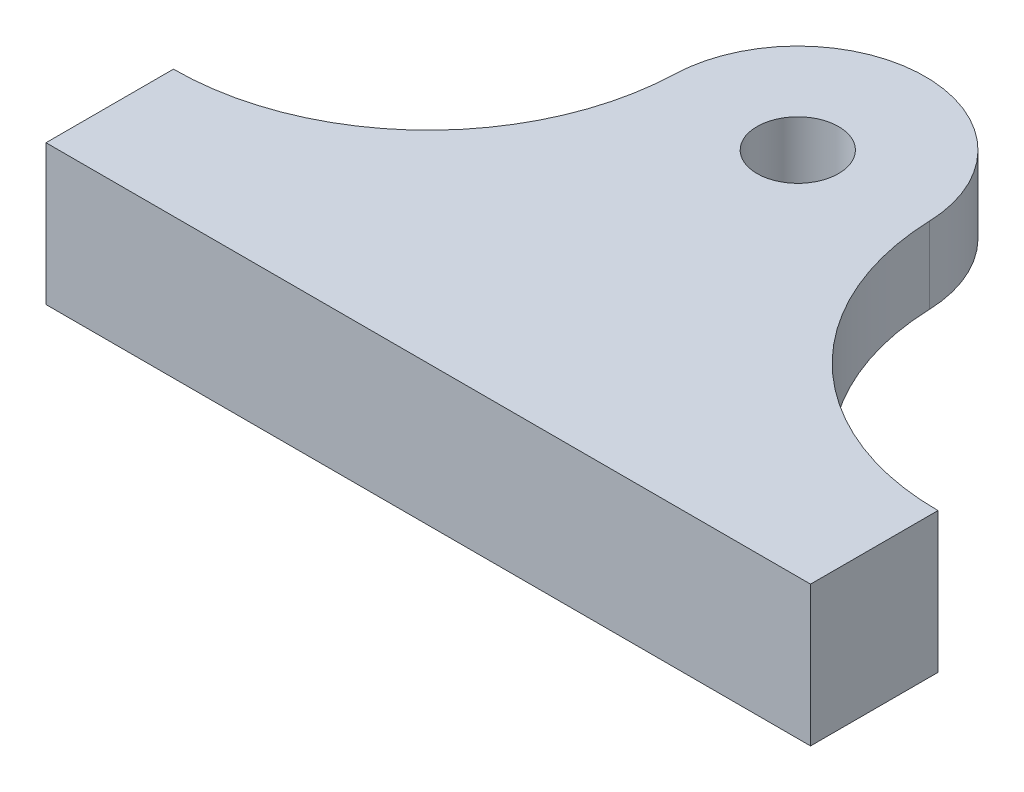
ISO-10303-21;
HEADER;
FILE_DESCRIPTION(('STEP AP214'),'2;1');
FILE_NAME('part.step','',(''),(''),'','','');
FILE_SCHEMA(('AUTOMOTIVE_DESIGN { 1 0 10303 214 1 1 1 1 }'));
ENDSEC;
DATA;
#1=APPLICATION_CONTEXT('core data for automotive mechanical design processes');
#2=APPLICATION_PROTOCOL_DEFINITION('international standard','automotive_design',2000,#1);
#3=PRODUCT_CONTEXT('',#1,'mechanical');
#4=PRODUCT('Part','Part','',(#3));
#5=PRODUCT_RELATED_PRODUCT_CATEGORY('part','',(#4));
#6=PRODUCT_DEFINITION_FORMATION('','',#4);
#7=PRODUCT_DEFINITION_CONTEXT('part definition',#1,'design');
#8=PRODUCT_DEFINITION('design','',#6,#7);
#9=PRODUCT_DEFINITION_SHAPE('','',#8);
#10=(LENGTH_UNIT() NAMED_UNIT(*) SI_UNIT(.MILLI.,.METRE.));
#11=(NAMED_UNIT(*) PLANE_ANGLE_UNIT() SI_UNIT($,.RADIAN.));
#12=(NAMED_UNIT(*) SI_UNIT($,.STERADIAN.) SOLID_ANGLE_UNIT());
#13=UNCERTAINTY_MEASURE_WITH_UNIT(LENGTH_MEASURE(1.E-05),#10,'distance_accuracy_value','');
#14=(GEOMETRIC_REPRESENTATION_CONTEXT(3) GLOBAL_UNCERTAINTY_ASSIGNED_CONTEXT((#13)) GLOBAL_UNIT_ASSIGNED_CONTEXT((#10,
#11,#12)) REPRESENTATION_CONTEXT('',''));
#15=CARTESIAN_POINT('',(0.,0.,0.));
#16=DIRECTION('',(0.,0.,1.));
#17=DIRECTION('',(1.,0.,0.));
#18=AXIS2_PLACEMENT_3D('',#15,#16,#17);
#19=CARTESIAN_POINT('',(0.,3.,0.));
#20=DIRECTION('',(0.,1.,0.));
#21=DIRECTION('',(0.,0.,1.));
#22=AXIS2_PLACEMENT_3D('',#19,#20,#21);
#23=PLANE('',#22);
#24=DIRECTION('',(-1.,0.,0.));
#25=VECTOR('',#24,1.);
#26=CARTESIAN_POINT('',(-15.,3.,9.5));
#27=LINE('',#26,#25);
#28=CARTESIAN_POINT('',(15.,3.,9.5));
#29=VERTEX_POINT('',#28);
#30=CARTESIAN_POINT('',(14.9916643505649,3.,9.5));
#31=VERTEX_POINT('',#30);
#32=EDGE_CURVE('E128',#29,#31,#27,.T.);
#33=ORIENTED_EDGE('',*,*,#32,.T.);
#34=CARTESIAN_POINT('',(14.9916643505649,3.,-0.500000000000004));
#35=DIRECTION('',(0.,1.,0.));
#36=DIRECTION('',(0.,0.,1.));
#37=AXIS2_PLACEMENT_3D('',#34,#35,#36);
#38=CIRCLE('',#37,10.);
#39=CARTESIAN_POINT('',(4.99722145018832,3.,-0.166666666666668));
#40=VERTEX_POINT('',#39);
#41=EDGE_CURVE('E11',#31,#40,#38,.F.);
#42=ORIENTED_EDGE('',*,*,#41,.T.);
#43=CARTESIAN_POINT('',(0.,3.,0.));
#44=DIRECTION('',(0.,1.,0.));
#45=DIRECTION('',(0.,0.,1.));
#46=AXIS2_PLACEMENT_3D('',#43,#44,#45);
#47=CIRCLE('',#46,5.);
#48=CARTESIAN_POINT('',(-4.99722145018832,3.,-0.166666666666667));
#49=VERTEX_POINT('',#48);
#50=EDGE_CURVE('E152',#40,#49,#47,.T.);
#51=ORIENTED_EDGE('',*,*,#50,.T.);
#52=CARTESIAN_POINT('',(-14.9916643505649,3.,-0.5));
#53=DIRECTION('',(0.,1.,0.));
#54=DIRECTION('',(0.,0.,1.));
#55=AXIS2_PLACEMENT_3D('',#52,#53,#54);
#56=CIRCLE('',#55,10.);
#57=CARTESIAN_POINT('',(-14.9916643505649,3.,9.5));
#58=VERTEX_POINT('',#57);
#59=EDGE_CURVE('E168',#49,#58,#56,.F.);
#60=ORIENTED_EDGE('',*,*,#59,.T.);
#61=CARTESIAN_POINT('',(-15.,3.,9.5));
#62=VERTEX_POINT('',#61);
#63=EDGE_CURVE('E130',#58,#62,#27,.T.);
#64=ORIENTED_EDGE('',*,*,#63,.T.);
#65=DIRECTION('',(0.,0.,1.));
#66=VECTOR('',#65,1.);
#67=CARTESIAN_POINT('',(-15.,3.,9.5));
#68=LINE('',#67,#66);
#69=CARTESIAN_POINT('',(-15.,3.,14.5));
#70=VERTEX_POINT('',#69);
#71=EDGE_CURVE('E135',#62,#70,#68,.T.);
#72=ORIENTED_EDGE('',*,*,#71,.T.);
#73=DIRECTION('',(1.,0.,0.));
#74=VECTOR('',#73,1.);
#75=CARTESIAN_POINT('',(-15.,3.,14.5));
#76=LINE('',#75,#74);
#77=CARTESIAN_POINT('',(15.,3.,14.5));
#78=VERTEX_POINT('',#77);
#79=EDGE_CURVE('E107',#70,#78,#76,.T.);
#80=ORIENTED_EDGE('',*,*,#79,.T.);
#81=DIRECTION('',(0.,0.,-1.));
#82=VECTOR('',#81,1.);
#83=CARTESIAN_POINT('',(15.,3.,9.5));
#84=LINE('',#83,#82);
#85=EDGE_CURVE('E138',#78,#29,#84,.T.);
#86=ORIENTED_EDGE('',*,*,#85,.T.);
#87=EDGE_LOOP('',(#33,#42,#51,#60,#64,#72,#80,#86));
#88=FACE_BOUND('',#87,.T.);
#89=CARTESIAN_POINT('',(0.,3.,0.));
#90=DIRECTION('',(0.,1.,0.));
#91=DIRECTION('',(0.,0.,1.));
#92=AXIS2_PLACEMENT_3D('',#89,#90,#91);
#93=CIRCLE('',#92,1.6);
#94=CARTESIAN_POINT('',(0.,3.,1.6));
#95=VERTEX_POINT('',#94);
#96=EDGE_CURVE('E146',#95,#95,#93,.T.);
#97=ORIENTED_EDGE('',*,*,#96,.F.);
#98=EDGE_LOOP('',(#97));
#99=FACE_BOUND('',#98,.T.);
#100=ADVANCED_FACE('F37',(#88,#99),#23,.T.);
#101=CARTESIAN_POINT('',(0.,0.,0.));
#102=DIRECTION('',(0.,1.,0.));
#103=DIRECTION('',(0.,0.,1.));
#104=AXIS2_PLACEMENT_3D('',#101,#102,#103);
#105=PLANE('',#104);
#106=CARTESIAN_POINT('',(0.,0.,0.));
#107=DIRECTION('',(0.,1.,0.));
#108=DIRECTION('',(0.,0.,1.));
#109=AXIS2_PLACEMENT_3D('',#106,#107,#108);
#110=CIRCLE('',#109,5.);
#111=CARTESIAN_POINT('',(4.99722145018832,0.,-0.166666666666668));
#112=VERTEX_POINT('',#111);
#113=CARTESIAN_POINT('',(-4.99722145018832,0.,-0.166666666666667));
#114=VERTEX_POINT('',#113);
#115=EDGE_CURVE('E149',#112,#114,#110,.T.);
#116=ORIENTED_EDGE('',*,*,#115,.F.);
#117=CARTESIAN_POINT('',(14.9916643505649,0.,-0.500000000000004));
#118=DIRECTION('',(0.,1.,0.));
#119=DIRECTION('',(0.,0.,1.));
#120=AXIS2_PLACEMENT_3D('',#117,#118,#119);
#121=CIRCLE('',#120,10.);
#122=CARTESIAN_POINT('',(14.9916643505649,0.,9.5));
#123=VERTEX_POINT('',#122);
#124=EDGE_CURVE('E45',#112,#123,#121,.T.);
#125=ORIENTED_EDGE('',*,*,#124,.T.);
#126=DIRECTION('',(1.,0.,0.));
#127=VECTOR('',#126,1.);
#128=CARTESIAN_POINT('',(-5.,0.,9.5));
#129=LINE('',#128,#127);
#130=CARTESIAN_POINT('',(-14.9916643505649,0.,9.5));
#131=VERTEX_POINT('',#130);
#132=EDGE_CURVE('E155',#131,#123,#129,.T.);
#133=ORIENTED_EDGE('',*,*,#132,.F.);
#134=CARTESIAN_POINT('',(-14.9916643505649,0.,-0.5));
#135=DIRECTION('',(0.,1.,0.));
#136=DIRECTION('',(0.,0.,1.));
#137=AXIS2_PLACEMENT_3D('',#134,#135,#136);
#138=CIRCLE('',#137,10.);
#139=EDGE_CURVE('E166',#131,#114,#138,.T.);
#140=ORIENTED_EDGE('',*,*,#139,.T.);
#141=EDGE_LOOP('',(#116,#125,#133,#140));
#142=FACE_BOUND('',#141,.T.);
#143=CARTESIAN_POINT('',(0.,0.,0.));
#144=DIRECTION('',(0.,1.,0.));
#145=DIRECTION('',(0.,0.,1.));
#146=AXIS2_PLACEMENT_3D('',#143,#144,#145);
#147=CIRCLE('',#146,1.6);
#148=CARTESIAN_POINT('',(0.,0.,1.6));
#149=VERTEX_POINT('',#148);
#150=EDGE_CURVE('E142',#149,#149,#147,.T.);
#151=ORIENTED_EDGE('',*,*,#150,.T.);
#152=EDGE_LOOP('',(#151));
#153=FACE_BOUND('',#152,.T.);
#154=ADVANCED_FACE('F173',(#142,#153),#105,.F.);
#155=CARTESIAN_POINT('',(0.,3.,0.));
#156=DIRECTION('',(0.,-1.,0.));
#157=DIRECTION('',(0.,0.,-1.));
#158=AXIS2_PLACEMENT_3D('',#155,#156,#157);
#159=CYLINDRICAL_SURFACE('',#158,5.);
#160=ORIENTED_EDGE('',*,*,#115,.T.);
#161=DIRECTION('',(0.,-1.,0.));
#162=VECTOR('',#161,1.);
#163=CARTESIAN_POINT('',(-4.99722145018832,3.,-0.166666666666667));
#164=LINE('',#163,#162);
#165=EDGE_CURVE('E52',#114,#49,#164,.F.);
#166=ORIENTED_EDGE('',*,*,#165,.T.);
#167=ORIENTED_EDGE('',*,*,#50,.F.);
#168=DIRECTION('',(0.,-1.,0.));
#169=VECTOR('',#168,1.);
#170=CARTESIAN_POINT('',(4.99722145018832,3.,-0.166666666666668));
#171=LINE('',#170,#169);
#172=EDGE_CURVE('E162',#40,#112,#171,.T.);
#173=ORIENTED_EDGE('',*,*,#172,.T.);
#174=EDGE_LOOP('',(#160,#166,#167,#173));
#175=FACE_BOUND('',#174,.T.);
#176=ADVANCED_FACE('F190',(#175),#159,.T.);
#177=CARTESIAN_POINT('',(0.,3.,0.));
#178=DIRECTION('',(0.,-1.,0.));
#179=DIRECTION('',(0.,0.,-1.));
#180=AXIS2_PLACEMENT_3D('',#177,#178,#179);
#181=CYLINDRICAL_SURFACE('',#180,1.6);
#182=ORIENTED_EDGE('',*,*,#96,.T.);
#183=EDGE_LOOP('',(#182));
#184=FACE_BOUND('',#183,.T.);
#185=ORIENTED_EDGE('',*,*,#150,.F.);
#186=EDGE_LOOP('',(#185));
#187=FACE_BOUND('',#186,.T.);
#188=ADVANCED_FACE('F192',(#184,#187),#181,.F.);
#189=CARTESIAN_POINT('',(-15.,-2.5,9.5));
#190=DIRECTION('',(0.,0.,-1.));
#191=DIRECTION('',(-1.,0.,0.));
#192=AXIS2_PLACEMENT_3D('',#189,#190,#191);
#193=PLANE('',#192);
#194=ORIENTED_EDGE('',*,*,#63,.F.);
#195=DIRECTION('',(0.,-1.,0.));
#196=VECTOR('',#195,1.);
#197=CARTESIAN_POINT('',(-14.9916643505649,-2.5,9.5));
#198=LINE('',#197,#196);
#199=EDGE_CURVE('E159',#58,#131,#198,.T.);
#200=ORIENTED_EDGE('',*,*,#199,.T.);
#201=ORIENTED_EDGE('',*,*,#132,.T.);
#202=DIRECTION('',(0.,-1.,0.));
#203=VECTOR('',#202,1.);
#204=CARTESIAN_POINT('',(14.9916643505649,-2.5,9.5));
#205=LINE('',#204,#203);
#206=EDGE_CURVE('E154',#123,#31,#205,.F.);
#207=ORIENTED_EDGE('',*,*,#206,.T.);
#208=ORIENTED_EDGE('',*,*,#32,.F.);
#209=DIRECTION('',(0.,1.,0.));
#210=VECTOR('',#209,1.);
#211=CARTESIAN_POINT('',(15.,-2.5,9.5));
#212=LINE('',#211,#210);
#213=CARTESIAN_POINT('',(15.,-2.5,9.5));
#214=VERTEX_POINT('',#213);
#215=EDGE_CURVE('E143',#214,#29,#212,.T.);
#216=ORIENTED_EDGE('',*,*,#215,.F.);
#217=DIRECTION('',(-1.,0.,0.));
#218=VECTOR('',#217,1.);
#219=CARTESIAN_POINT('',(-15.,-2.5,9.5));
#220=LINE('',#219,#218);
#221=CARTESIAN_POINT('',(-15.,-2.5,9.5));
#222=VERTEX_POINT('',#221);
#223=EDGE_CURVE('E113',#214,#222,#220,.T.);
#224=ORIENTED_EDGE('',*,*,#223,.T.);
#225=DIRECTION('',(0.,1.,0.));
#226=VECTOR('',#225,1.);
#227=CARTESIAN_POINT('',(-15.,-2.5,9.5));
#228=LINE('',#227,#226);
#229=EDGE_CURVE('E127',#222,#62,#228,.T.);
#230=ORIENTED_EDGE('',*,*,#229,.T.);
#231=EDGE_LOOP('',(#194,#200,#201,#207,#208,#216,#224,#230));
#232=FACE_BOUND('',#231,.T.);
#233=ADVANCED_FACE('F181',(#232),#193,.T.);
#234=CARTESIAN_POINT('',(-15.,-2.5,9.5));
#235=DIRECTION('',(-1.,0.,0.));
#236=DIRECTION('',(0.,0.,1.));
#237=AXIS2_PLACEMENT_3D('',#234,#235,#236);
#238=PLANE('',#237);
#239=ORIENTED_EDGE('',*,*,#71,.F.);
#240=ORIENTED_EDGE('',*,*,#229,.F.);
#241=DIRECTION('',(0.,0.,1.));
#242=VECTOR('',#241,1.);
#243=CARTESIAN_POINT('',(-15.,-2.5,9.5));
#244=LINE('',#243,#242);
#245=CARTESIAN_POINT('',(-15.,-2.5,14.5));
#246=VERTEX_POINT('',#245);
#247=EDGE_CURVE('E120',#222,#246,#244,.T.);
#248=ORIENTED_EDGE('',*,*,#247,.T.);
#249=DIRECTION('',(0.,1.,0.));
#250=VECTOR('',#249,1.);
#251=CARTESIAN_POINT('',(-15.,-2.5,14.5));
#252=LINE('',#251,#250);
#253=EDGE_CURVE('E102',#246,#70,#252,.T.);
#254=ORIENTED_EDGE('',*,*,#253,.T.);
#255=EDGE_LOOP('',(#239,#240,#248,#254));
#256=FACE_BOUND('',#255,.T.);
#257=ADVANCED_FACE('F125',(#256),#238,.T.);
#258=CARTESIAN_POINT('',(15.,-2.5,9.5));
#259=DIRECTION('',(1.,0.,0.));
#260=DIRECTION('',(0.,0.,-1.));
#261=AXIS2_PLACEMENT_3D('',#258,#259,#260);
#262=PLANE('',#261);
#263=ORIENTED_EDGE('',*,*,#85,.F.);
#264=DIRECTION('',(0.,1.,0.));
#265=VECTOR('',#264,1.);
#266=CARTESIAN_POINT('',(15.,-2.5,14.5));
#267=LINE('',#266,#265);
#268=CARTESIAN_POINT('',(15.,-2.5,14.5));
#269=VERTEX_POINT('',#268);
#270=EDGE_CURVE('E112',#269,#78,#267,.T.);
#271=ORIENTED_EDGE('',*,*,#270,.F.);
#272=DIRECTION('',(0.,0.,-1.));
#273=VECTOR('',#272,1.);
#274=CARTESIAN_POINT('',(15.,-2.5,9.5));
#275=LINE('',#274,#273);
#276=EDGE_CURVE('E123',#269,#214,#275,.T.);
#277=ORIENTED_EDGE('',*,*,#276,.T.);
#278=ORIENTED_EDGE('',*,*,#215,.T.);
#279=EDGE_LOOP('',(#263,#271,#277,#278));
#280=FACE_BOUND('',#279,.T.);
#281=ADVANCED_FACE('F185',(#280),#262,.T.);
#282=CARTESIAN_POINT('',(-15.,-2.5,14.5));
#283=DIRECTION('',(0.,0.,1.));
#284=DIRECTION('',(1.,0.,0.));
#285=AXIS2_PLACEMENT_3D('',#282,#283,#284);
#286=PLANE('',#285);
#287=ORIENTED_EDGE('',*,*,#79,.F.);
#288=ORIENTED_EDGE('',*,*,#253,.F.);
#289=DIRECTION('',(1.,0.,0.));
#290=VECTOR('',#289,1.);
#291=CARTESIAN_POINT('',(-15.,-2.5,14.5));
#292=LINE('',#291,#290);
#293=EDGE_CURVE('E105',#246,#269,#292,.T.);
#294=ORIENTED_EDGE('',*,*,#293,.T.);
#295=ORIENTED_EDGE('',*,*,#270,.T.);
#296=EDGE_LOOP('',(#287,#288,#294,#295));
#297=FACE_BOUND('',#296,.T.);
#298=ADVANCED_FACE('F104',(#297),#286,.T.);
#299=CARTESIAN_POINT('',(0.,-2.5,0.));
#300=DIRECTION('',(0.,1.,0.));
#301=DIRECTION('',(0.,0.,1.));
#302=AXIS2_PLACEMENT_3D('',#299,#300,#301);
#303=PLANE('',#302);
#304=ORIENTED_EDGE('',*,*,#247,.F.);
#305=ORIENTED_EDGE('',*,*,#223,.F.);
#306=ORIENTED_EDGE('',*,*,#276,.F.);
#307=ORIENTED_EDGE('',*,*,#293,.F.);
#308=EDGE_LOOP('',(#304,#305,#306,#307));
#309=FACE_BOUND('',#308,.T.);
#310=ADVANCED_FACE('F118',(#309),#303,.F.);
#311=CARTESIAN_POINT('',(-14.9916643505649,3.,-0.5));
#312=DIRECTION('',(0.,-1.,0.));
#313=DIRECTION('',(0.,0.,-1.));
#314=AXIS2_PLACEMENT_3D('',#311,#312,#313);
#315=CYLINDRICAL_SURFACE('',#314,10.);
#316=ORIENTED_EDGE('',*,*,#59,.F.);
#317=ORIENTED_EDGE('',*,*,#165,.F.);
#318=ORIENTED_EDGE('',*,*,#139,.F.);
#319=ORIENTED_EDGE('',*,*,#199,.F.);
#320=EDGE_LOOP('',(#316,#317,#318,#319));
#321=FACE_BOUND('',#320,.T.);
#322=ADVANCED_FACE('F189',(#321),#315,.F.);
#323=CARTESIAN_POINT('',(14.9916643505649,3.,-0.500000000000004));
#324=DIRECTION('',(0.,-1.,0.));
#325=DIRECTION('',(0.,0.,-1.));
#326=AXIS2_PLACEMENT_3D('',#323,#324,#325);
#327=CYLINDRICAL_SURFACE('',#326,10.);
#328=ORIENTED_EDGE('',*,*,#41,.F.);
#329=ORIENTED_EDGE('',*,*,#206,.F.);
#330=ORIENTED_EDGE('',*,*,#124,.F.);
#331=ORIENTED_EDGE('',*,*,#172,.F.);
#332=EDGE_LOOP('',(#328,#329,#330,#331));
#333=FACE_BOUND('',#332,.T.);
#334=ADVANCED_FACE('F39',(#333),#327,.F.);
#335=CLOSED_SHELL('',(#100,#154,#176,#188,#233,#257,#281,#298,#310,#322,#334));
#336=MANIFOLD_SOLID_BREP('B2',#335);
#337=ADVANCED_BREP_SHAPE_REPRESENTATION('',(#18,#336),#14);
#338=SHAPE_DEFINITION_REPRESENTATION(#9,#337);
ENDSEC;
END-ISO-10303-21;
